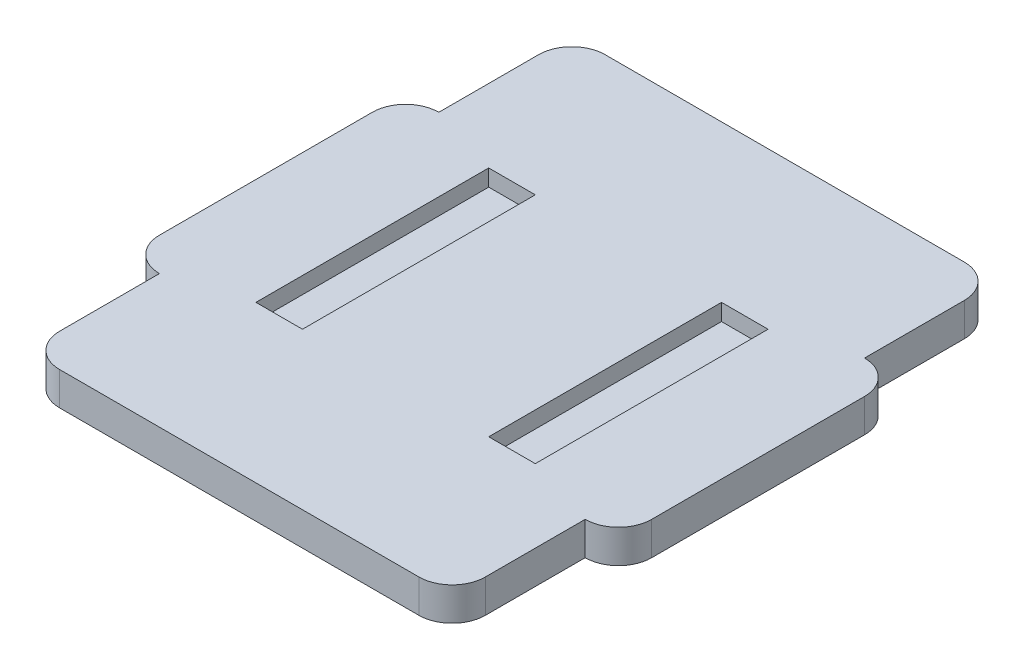
ISO-10303-21;
HEADER;
FILE_DESCRIPTION(('STEP AP214'),'2;1');
FILE_NAME('part.step','',(''),(''),'','','');
FILE_SCHEMA(('AUTOMOTIVE_DESIGN { 1 0 10303 214 1 1 1 1 }'));
ENDSEC;
DATA;
#1=APPLICATION_CONTEXT('core data for automotive mechanical design processes');
#2=APPLICATION_PROTOCOL_DEFINITION('international standard','automotive_design',2000,#1);
#3=PRODUCT_CONTEXT('',#1,'mechanical');
#4=PRODUCT('Part','Part','',(#3));
#5=PRODUCT_RELATED_PRODUCT_CATEGORY('part','',(#4));
#6=PRODUCT_DEFINITION_FORMATION('','',#4);
#7=PRODUCT_DEFINITION_CONTEXT('part definition',#1,'design');
#8=PRODUCT_DEFINITION('design','',#6,#7);
#9=PRODUCT_DEFINITION_SHAPE('','',#8);
#10=(LENGTH_UNIT() NAMED_UNIT(*) SI_UNIT(.MILLI.,.METRE.));
#11=(NAMED_UNIT(*) PLANE_ANGLE_UNIT() SI_UNIT($,.RADIAN.));
#12=(NAMED_UNIT(*) SI_UNIT($,.STERADIAN.) SOLID_ANGLE_UNIT());
#13=UNCERTAINTY_MEASURE_WITH_UNIT(LENGTH_MEASURE(1.E-05),#10,'distance_accuracy_value','');
#14=(GEOMETRIC_REPRESENTATION_CONTEXT(3) GLOBAL_UNCERTAINTY_ASSIGNED_CONTEXT((#13)) GLOBAL_UNIT_ASSIGNED_CONTEXT((#10,
#11,#12)) REPRESENTATION_CONTEXT('',''));
#15=CARTESIAN_POINT('',(0.,0.,0.));
#16=DIRECTION('',(0.,0.,1.));
#17=DIRECTION('',(1.,0.,0.));
#18=AXIS2_PLACEMENT_3D('',#15,#16,#17);
#19=CARTESIAN_POINT('',(46.,5.,-37.));
#20=DIRECTION('',(0.,-1.,0.));
#21=DIRECTION('',(0.,0.,-1.));
#22=AXIS2_PLACEMENT_3D('',#19,#20,#21);
#23=CYLINDRICAL_SURFACE('',#22,5.);
#24=CARTESIAN_POINT('',(46.,0.,-37.));
#25=DIRECTION('',(0.,1.,0.));
#26=DIRECTION('',(0.,0.,1.));
#27=AXIS2_PLACEMENT_3D('',#24,#25,#26);
#28=CIRCLE('',#27,5.);
#29=CARTESIAN_POINT('',(51.,0.,-37.));
#30=VERTEX_POINT('',#29);
#31=CARTESIAN_POINT('',(46.,0.,-42.));
#32=VERTEX_POINT('',#31);
#33=EDGE_CURVE('E266',#30,#32,#28,.T.);
#34=ORIENTED_EDGE('',*,*,#33,.T.);
#35=DIRECTION('',(0.,-1.,0.));
#36=VECTOR('',#35,1.);
#37=CARTESIAN_POINT('',(46.,5.,-42.));
#38=LINE('',#37,#36);
#39=CARTESIAN_POINT('',(46.,5.,-42.));
#40=VERTEX_POINT('',#39);
#41=EDGE_CURVE('E11',#40,#32,#38,.T.);
#42=ORIENTED_EDGE('',*,*,#41,.F.);
#43=CARTESIAN_POINT('',(46.,5.,-37.));
#44=DIRECTION('',(0.,1.,0.));
#45=DIRECTION('',(0.,0.,1.));
#46=AXIS2_PLACEMENT_3D('',#43,#44,#45);
#47=CIRCLE('',#46,5.);
#48=CARTESIAN_POINT('',(51.,5.,-37.));
#49=VERTEX_POINT('',#48);
#50=EDGE_CURVE('E284',#49,#40,#47,.T.);
#51=ORIENTED_EDGE('',*,*,#50,.F.);
#52=DIRECTION('',(0.,-1.,0.));
#53=VECTOR('',#52,1.);
#54=CARTESIAN_POINT('',(51.,5.,-37.));
#55=LINE('',#54,#53);
#56=EDGE_CURVE('E236',#49,#30,#55,.T.);
#57=ORIENTED_EDGE('',*,*,#56,.T.);
#58=EDGE_LOOP('',(#34,#42,#51,#57));
#59=FACE_BOUND('',#58,.T.);
#60=ADVANCED_FACE('F43',(#59),#23,.T.);
#61=CARTESIAN_POINT('',(46.,5.,0.));
#62=DIRECTION('',(-1.,0.,0.));
#63=DIRECTION('',(0.,0.,1.));
#64=AXIS2_PLACEMENT_3D('',#61,#62,#63);
#65=PLANE('',#64);
#66=DIRECTION('',(0.,0.,-1.));
#67=VECTOR('',#66,1.);
#68=CARTESIAN_POINT('',(46.,0.,0.));
#69=LINE('',#68,#67);
#70=CARTESIAN_POINT('',(46.,0.,-57.));
#71=VERTEX_POINT('',#70);
#72=EDGE_CURVE('E326',#32,#71,#69,.T.);
#73=ORIENTED_EDGE('',*,*,#72,.T.);
#74=DIRECTION('',(0.,-1.,0.));
#75=VECTOR('',#74,1.);
#76=CARTESIAN_POINT('',(46.,5.,-57.));
#77=LINE('',#76,#75);
#78=CARTESIAN_POINT('',(46.,5.,-57.));
#79=VERTEX_POINT('',#78);
#80=EDGE_CURVE('E52',#79,#71,#77,.T.);
#81=ORIENTED_EDGE('',*,*,#80,.F.);
#82=DIRECTION('',(0.,0.,-1.));
#83=VECTOR('',#82,1.);
#84=CARTESIAN_POINT('',(46.,5.,0.));
#85=LINE('',#84,#83);
#86=EDGE_CURVE('E287',#40,#79,#85,.T.);
#87=ORIENTED_EDGE('',*,*,#86,.F.);
#88=ORIENTED_EDGE('',*,*,#41,.T.);
#89=EDGE_LOOP('',(#73,#81,#87,#88));
#90=FACE_BOUND('',#89,.T.);
#91=ADVANCED_FACE('F420',(#90),#65,.F.);
#92=CARTESIAN_POINT('',(41.,5.,-57.));
#93=DIRECTION('',(0.,-1.,0.));
#94=DIRECTION('',(0.,0.,-1.));
#95=AXIS2_PLACEMENT_3D('',#92,#93,#94);
#96=CYLINDRICAL_SURFACE('',#95,5.);
#97=CARTESIAN_POINT('',(41.,0.,-57.));
#98=DIRECTION('',(0.,1.,0.));
#99=DIRECTION('',(0.,0.,1.));
#100=AXIS2_PLACEMENT_3D('',#97,#98,#99);
#101=CIRCLE('',#100,5.);
#102=CARTESIAN_POINT('',(41.,0.,-62.));
#103=VERTEX_POINT('',#102);
#104=EDGE_CURVE('E328',#71,#103,#101,.T.);
#105=ORIENTED_EDGE('',*,*,#104,.T.);
#106=DIRECTION('',(0.,-1.,0.));
#107=VECTOR('',#106,1.);
#108=CARTESIAN_POINT('',(41.,5.,-62.));
#109=LINE('',#108,#107);
#110=CARTESIAN_POINT('',(41.,5.,-62.));
#111=VERTEX_POINT('',#110);
#112=EDGE_CURVE('E394',#111,#103,#109,.T.);
#113=ORIENTED_EDGE('',*,*,#112,.F.);
#114=CARTESIAN_POINT('',(41.,5.,-57.));
#115=DIRECTION('',(0.,1.,0.));
#116=DIRECTION('',(0.,0.,1.));
#117=AXIS2_PLACEMENT_3D('',#114,#115,#116);
#118=CIRCLE('',#117,5.);
#119=EDGE_CURVE('E289',#79,#111,#118,.T.);
#120=ORIENTED_EDGE('',*,*,#119,.F.);
#121=ORIENTED_EDGE('',*,*,#80,.T.);
#122=EDGE_LOOP('',(#105,#113,#120,#121));
#123=FACE_BOUND('',#122,.T.);
#124=ADVANCED_FACE('F401',(#123),#96,.T.);
#125=CARTESIAN_POINT('',(0.,5.,-62.));
#126=DIRECTION('',(0.,0.,-1.));
#127=DIRECTION('',(-1.,0.,0.));
#128=AXIS2_PLACEMENT_3D('',#125,#126,#127);
#129=PLANE('',#128);
#130=DIRECTION('',(1.,0.,0.));
#131=VECTOR('',#130,1.);
#132=CARTESIAN_POINT('',(0.,0.,-62.));
#133=LINE('',#132,#131);
#134=CARTESIAN_POINT('',(-13.,0.,-62.));
#135=VERTEX_POINT('',#134);
#136=EDGE_CURVE('E331',#135,#103,#133,.T.);
#137=ORIENTED_EDGE('',*,*,#136,.F.);
#138=DIRECTION('',(0.,-1.,0.));
#139=VECTOR('',#138,1.);
#140=CARTESIAN_POINT('',(-13.,5.,-62.));
#141=LINE('',#140,#139);
#142=CARTESIAN_POINT('',(-13.,5.,-62.));
#143=VERTEX_POINT('',#142);
#144=EDGE_CURVE('E392',#143,#135,#141,.T.);
#145=ORIENTED_EDGE('',*,*,#144,.F.);
#146=DIRECTION('',(1.,0.,0.));
#147=VECTOR('',#146,1.);
#148=CARTESIAN_POINT('',(0.,5.,-62.));
#149=LINE('',#148,#147);
#150=EDGE_CURVE('E291',#143,#111,#149,.T.);
#151=ORIENTED_EDGE('',*,*,#150,.T.);
#152=ORIENTED_EDGE('',*,*,#112,.T.);
#153=EDGE_LOOP('',(#137,#145,#151,#152));
#154=FACE_BOUND('',#153,.T.);
#155=ADVANCED_FACE('F410',(#154),#129,.T.);
#156=CARTESIAN_POINT('',(-13.,5.,-57.));
#157=DIRECTION('',(0.,-1.,0.));
#158=DIRECTION('',(0.,0.,-1.));
#159=AXIS2_PLACEMENT_3D('',#156,#157,#158);
#160=CYLINDRICAL_SURFACE('',#159,5.);
#161=CARTESIAN_POINT('',(-13.,0.,-57.));
#162=DIRECTION('',(0.,1.,0.));
#163=DIRECTION('',(0.,0.,1.));
#164=AXIS2_PLACEMENT_3D('',#161,#162,#163);
#165=CIRCLE('',#164,5.);
#166=CARTESIAN_POINT('',(-18.,0.,-57.));
#167=VERTEX_POINT('',#166);
#168=EDGE_CURVE('E334',#135,#167,#165,.T.);
#169=ORIENTED_EDGE('',*,*,#168,.T.);
#170=DIRECTION('',(0.,-1.,0.));
#171=VECTOR('',#170,1.);
#172=CARTESIAN_POINT('',(-18.,5.,-57.));
#173=LINE('',#172,#171);
#174=CARTESIAN_POINT('',(-18.,5.,-57.));
#175=VERTEX_POINT('',#174);
#176=EDGE_CURVE('E390',#175,#167,#173,.T.);
#177=ORIENTED_EDGE('',*,*,#176,.F.);
#178=CARTESIAN_POINT('',(-13.,5.,-57.));
#179=DIRECTION('',(0.,1.,0.));
#180=DIRECTION('',(0.,0.,1.));
#181=AXIS2_PLACEMENT_3D('',#178,#179,#180);
#182=CIRCLE('',#181,5.);
#183=EDGE_CURVE('E294',#143,#175,#182,.T.);
#184=ORIENTED_EDGE('',*,*,#183,.F.);
#185=ORIENTED_EDGE('',*,*,#144,.T.);
#186=EDGE_LOOP('',(#169,#177,#184,#185));
#187=FACE_BOUND('',#186,.T.);
#188=ADVANCED_FACE('F468',(#187),#160,.T.);
#189=CARTESIAN_POINT('',(-18.,5.,0.));
#190=DIRECTION('',(-1.,0.,0.));
#191=DIRECTION('',(0.,0.,1.));
#192=AXIS2_PLACEMENT_3D('',#189,#190,#191);
#193=PLANE('',#192);
#194=DIRECTION('',(0.,0.,-1.));
#195=VECTOR('',#194,1.);
#196=CARTESIAN_POINT('',(-18.,0.,0.));
#197=LINE('',#196,#195);
#198=CARTESIAN_POINT('',(-18.,0.,-42.));
#199=VERTEX_POINT('',#198);
#200=EDGE_CURVE('E337',#199,#167,#197,.T.);
#201=ORIENTED_EDGE('',*,*,#200,.F.);
#202=DIRECTION('',(0.,-1.,0.));
#203=VECTOR('',#202,1.);
#204=CARTESIAN_POINT('',(-18.,5.,-42.));
#205=LINE('',#204,#203);
#206=CARTESIAN_POINT('',(-18.,5.,-42.));
#207=VERTEX_POINT('',#206);
#208=EDGE_CURVE('E388',#207,#199,#205,.T.);
#209=ORIENTED_EDGE('',*,*,#208,.F.);
#210=DIRECTION('',(0.,0.,-1.));
#211=VECTOR('',#210,1.);
#212=CARTESIAN_POINT('',(-18.,5.,0.));
#213=LINE('',#212,#211);
#214=EDGE_CURVE('E296',#207,#175,#213,.T.);
#215=ORIENTED_EDGE('',*,*,#214,.T.);
#216=ORIENTED_EDGE('',*,*,#176,.T.);
#217=EDGE_LOOP('',(#201,#209,#215,#216));
#218=FACE_BOUND('',#217,.T.);
#219=ADVANCED_FACE('F466',(#218),#193,.T.);
#220=CARTESIAN_POINT('',(-18.,5.,-37.));
#221=DIRECTION('',(0.,-1.,0.));
#222=DIRECTION('',(0.,0.,-1.));
#223=AXIS2_PLACEMENT_3D('',#220,#221,#222);
#224=CYLINDRICAL_SURFACE('',#223,5.);
#225=CARTESIAN_POINT('',(-18.,0.,-37.));
#226=DIRECTION('',(0.,1.,0.));
#227=DIRECTION('',(0.,0.,1.));
#228=AXIS2_PLACEMENT_3D('',#225,#226,#227);
#229=CIRCLE('',#228,5.);
#230=CARTESIAN_POINT('',(-23.,0.,-37.));
#231=VERTEX_POINT('',#230);
#232=EDGE_CURVE('E340',#231,#199,#229,.F.);
#233=ORIENTED_EDGE('',*,*,#232,.F.);
#234=DIRECTION('',(0.,-1.,0.));
#235=VECTOR('',#234,1.);
#236=CARTESIAN_POINT('',(-23.,5.,-37.));
#237=LINE('',#236,#235);
#238=CARTESIAN_POINT('',(-23.,5.,-37.));
#239=VERTEX_POINT('',#238);
#240=EDGE_CURVE('E386',#239,#231,#237,.T.);
#241=ORIENTED_EDGE('',*,*,#240,.F.);
#242=CARTESIAN_POINT('',(-18.,5.,-37.));
#243=DIRECTION('',(0.,1.,0.));
#244=DIRECTION('',(0.,0.,1.));
#245=AXIS2_PLACEMENT_3D('',#242,#243,#244);
#246=CIRCLE('',#245,5.);
#247=EDGE_CURVE('E299',#239,#207,#246,.F.);
#248=ORIENTED_EDGE('',*,*,#247,.T.);
#249=ORIENTED_EDGE('',*,*,#208,.T.);
#250=EDGE_LOOP('',(#233,#241,#248,#249));
#251=FACE_BOUND('',#250,.T.);
#252=ADVANCED_FACE('F463',(#251),#224,.T.);
#253=CARTESIAN_POINT('',(-23.,5.,0.));
#254=DIRECTION('',(-1.,0.,0.));
#255=DIRECTION('',(0.,0.,1.));
#256=AXIS2_PLACEMENT_3D('',#253,#254,#255);
#257=PLANE('',#256);
#258=DIRECTION('',(0.,0.,-1.));
#259=VECTOR('',#258,1.);
#260=CARTESIAN_POINT('',(-23.,0.,0.));
#261=LINE('',#260,#259);
#262=CARTESIAN_POINT('',(-23.,0.,-5.));
#263=VERTEX_POINT('',#262);
#264=EDGE_CURVE('E343',#263,#231,#261,.T.);
#265=ORIENTED_EDGE('',*,*,#264,.F.);
#266=DIRECTION('',(0.,-1.,0.));
#267=VECTOR('',#266,1.);
#268=CARTESIAN_POINT('',(-23.,5.,-5.));
#269=LINE('',#268,#267);
#270=CARTESIAN_POINT('',(-23.,5.,-5.));
#271=VERTEX_POINT('',#270);
#272=EDGE_CURVE('E384',#271,#263,#269,.T.);
#273=ORIENTED_EDGE('',*,*,#272,.F.);
#274=DIRECTION('',(0.,0.,-1.));
#275=VECTOR('',#274,1.);
#276=CARTESIAN_POINT('',(-23.,5.,0.));
#277=LINE('',#276,#275);
#278=EDGE_CURVE('E302',#271,#239,#277,.T.);
#279=ORIENTED_EDGE('',*,*,#278,.T.);
#280=ORIENTED_EDGE('',*,*,#240,.T.);
#281=EDGE_LOOP('',(#265,#273,#279,#280));
#282=FACE_BOUND('',#281,.T.);
#283=ADVANCED_FACE('F459',(#282),#257,.T.);
#284=CARTESIAN_POINT('',(-18.,5.,-5.));
#285=DIRECTION('',(0.,-1.,0.));
#286=DIRECTION('',(0.,0.,-1.));
#287=AXIS2_PLACEMENT_3D('',#284,#285,#286);
#288=CYLINDRICAL_SURFACE('',#287,5.);
#289=CARTESIAN_POINT('',(-18.,0.,-5.));
#290=DIRECTION('',(0.,1.,0.));
#291=DIRECTION('',(0.,0.,1.));
#292=AXIS2_PLACEMENT_3D('',#289,#290,#291);
#293=CIRCLE('',#292,5.);
#294=CARTESIAN_POINT('',(-18.,0.,0.));
#295=VERTEX_POINT('',#294);
#296=EDGE_CURVE('E346',#295,#263,#293,.F.);
#297=ORIENTED_EDGE('',*,*,#296,.F.);
#298=DIRECTION('',(0.,-1.,0.));
#299=VECTOR('',#298,1.);
#300=CARTESIAN_POINT('',(-18.,5.,0.));
#301=LINE('',#300,#299);
#302=CARTESIAN_POINT('',(-18.,5.,0.));
#303=VERTEX_POINT('',#302);
#304=EDGE_CURVE('E382',#303,#295,#301,.T.);
#305=ORIENTED_EDGE('',*,*,#304,.F.);
#306=CARTESIAN_POINT('',(-18.,5.,-5.));
#307=DIRECTION('',(0.,1.,0.));
#308=DIRECTION('',(0.,0.,1.));
#309=AXIS2_PLACEMENT_3D('',#306,#307,#308);
#310=CIRCLE('',#309,5.);
#311=EDGE_CURVE('E305',#303,#271,#310,.F.);
#312=ORIENTED_EDGE('',*,*,#311,.T.);
#313=ORIENTED_EDGE('',*,*,#272,.T.);
#314=EDGE_LOOP('',(#297,#305,#312,#313));
#315=FACE_BOUND('',#314,.T.);
#316=ADVANCED_FACE('F454',(#315),#288,.T.);
#317=CARTESIAN_POINT('',(-18.,5.,0.));
#318=DIRECTION('',(1.,0.,0.));
#319=DIRECTION('',(0.,0.,-1.));
#320=AXIS2_PLACEMENT_3D('',#317,#318,#319);
#321=PLANE('',#320);
#322=DIRECTION('',(0.,0.,1.));
#323=VECTOR('',#322,1.);
#324=CARTESIAN_POINT('',(-18.,0.,0.));
#325=LINE('',#324,#323);
#326=CARTESIAN_POINT('',(-18.,0.,15.));
#327=VERTEX_POINT('',#326);
#328=EDGE_CURVE('E349',#295,#327,#325,.T.);
#329=ORIENTED_EDGE('',*,*,#328,.T.);
#330=DIRECTION('',(0.,-1.,0.));
#331=VECTOR('',#330,1.);
#332=CARTESIAN_POINT('',(-18.,5.,15.));
#333=LINE('',#332,#331);
#334=CARTESIAN_POINT('',(-18.,5.,15.));
#335=VERTEX_POINT('',#334);
#336=EDGE_CURVE('E380',#335,#327,#333,.T.);
#337=ORIENTED_EDGE('',*,*,#336,.F.);
#338=DIRECTION('',(0.,0.,1.));
#339=VECTOR('',#338,1.);
#340=CARTESIAN_POINT('',(-18.,5.,0.));
#341=LINE('',#340,#339);
#342=EDGE_CURVE('E308',#303,#335,#341,.T.);
#343=ORIENTED_EDGE('',*,*,#342,.F.);
#344=ORIENTED_EDGE('',*,*,#304,.T.);
#345=EDGE_LOOP('',(#329,#337,#343,#344));
#346=FACE_BOUND('',#345,.T.);
#347=ADVANCED_FACE('F451',(#346),#321,.F.);
#348=CARTESIAN_POINT('',(-13.,5.,15.));
#349=DIRECTION('',(0.,-1.,0.));
#350=DIRECTION('',(0.,0.,-1.));
#351=AXIS2_PLACEMENT_3D('',#348,#349,#350);
#352=CYLINDRICAL_SURFACE('',#351,5.);
#353=CARTESIAN_POINT('',(-13.,0.,15.));
#354=DIRECTION('',(0.,1.,0.));
#355=DIRECTION('',(0.,0.,1.));
#356=AXIS2_PLACEMENT_3D('',#353,#354,#355);
#357=CIRCLE('',#356,5.);
#358=CARTESIAN_POINT('',(-13.,0.,20.));
#359=VERTEX_POINT('',#358);
#360=EDGE_CURVE('E352',#359,#327,#357,.F.);
#361=ORIENTED_EDGE('',*,*,#360,.F.);
#362=DIRECTION('',(0.,-1.,0.));
#363=VECTOR('',#362,1.);
#364=CARTESIAN_POINT('',(-13.,5.,20.));
#365=LINE('',#364,#363);
#366=CARTESIAN_POINT('',(-13.,5.,20.));
#367=VERTEX_POINT('',#366);
#368=EDGE_CURVE('E378',#367,#359,#365,.T.);
#369=ORIENTED_EDGE('',*,*,#368,.F.);
#370=CARTESIAN_POINT('',(-13.,5.,15.));
#371=DIRECTION('',(0.,1.,0.));
#372=DIRECTION('',(0.,0.,1.));
#373=AXIS2_PLACEMENT_3D('',#370,#371,#372);
#374=CIRCLE('',#373,5.);
#375=EDGE_CURVE('E310',#367,#335,#374,.F.);
#376=ORIENTED_EDGE('',*,*,#375,.T.);
#377=ORIENTED_EDGE('',*,*,#336,.T.);
#378=EDGE_LOOP('',(#361,#369,#376,#377));
#379=FACE_BOUND('',#378,.T.);
#380=ADVANCED_FACE('F445',(#379),#352,.T.);
#381=CARTESIAN_POINT('',(0.,5.,20.));
#382=DIRECTION('',(0.,0.,-1.));
#383=DIRECTION('',(-1.,0.,0.));
#384=AXIS2_PLACEMENT_3D('',#381,#382,#383);
#385=PLANE('',#384);
#386=DIRECTION('',(1.,0.,0.));
#387=VECTOR('',#386,1.);
#388=CARTESIAN_POINT('',(0.,0.,20.));
#389=LINE('',#388,#387);
#390=CARTESIAN_POINT('',(41.,0.,20.));
#391=VERTEX_POINT('',#390);
#392=EDGE_CURVE('E355',#359,#391,#389,.T.);
#393=ORIENTED_EDGE('',*,*,#392,.T.);
#394=DIRECTION('',(0.,-1.,0.));
#395=VECTOR('',#394,1.);
#396=CARTESIAN_POINT('',(41.,5.,20.));
#397=LINE('',#396,#395);
#398=CARTESIAN_POINT('',(41.,5.,20.));
#399=VERTEX_POINT('',#398);
#400=EDGE_CURVE('E375',#399,#391,#397,.T.);
#401=ORIENTED_EDGE('',*,*,#400,.F.);
#402=DIRECTION('',(1.,0.,0.));
#403=VECTOR('',#402,1.);
#404=CARTESIAN_POINT('',(0.,5.,20.));
#405=LINE('',#404,#403);
#406=EDGE_CURVE('E313',#367,#399,#405,.T.);
#407=ORIENTED_EDGE('',*,*,#406,.F.);
#408=ORIENTED_EDGE('',*,*,#368,.T.);
#409=EDGE_LOOP('',(#393,#401,#407,#408));
#410=FACE_BOUND('',#409,.T.);
#411=ADVANCED_FACE('F533',(#410),#385,.F.);
#412=CARTESIAN_POINT('',(41.,5.,15.));
#413=DIRECTION('',(0.,-1.,0.));
#414=DIRECTION('',(0.,0.,-1.));
#415=AXIS2_PLACEMENT_3D('',#412,#413,#414);
#416=CYLINDRICAL_SURFACE('',#415,5.);
#417=CARTESIAN_POINT('',(41.,0.,15.));
#418=DIRECTION('',(0.,1.,0.));
#419=DIRECTION('',(0.,0.,1.));
#420=AXIS2_PLACEMENT_3D('',#417,#418,#419);
#421=CIRCLE('',#420,5.);
#422=CARTESIAN_POINT('',(46.,0.,15.));
#423=VERTEX_POINT('',#422);
#424=EDGE_CURVE('E357',#391,#423,#421,.T.);
#425=ORIENTED_EDGE('',*,*,#424,.T.);
#426=DIRECTION('',(0.,-1.,0.));
#427=VECTOR('',#426,1.);
#428=CARTESIAN_POINT('',(46.,5.,15.));
#429=LINE('',#428,#427);
#430=CARTESIAN_POINT('',(46.,5.,15.));
#431=VERTEX_POINT('',#430);
#432=EDGE_CURVE('E373',#431,#423,#429,.T.);
#433=ORIENTED_EDGE('',*,*,#432,.F.);
#434=CARTESIAN_POINT('',(41.,5.,15.));
#435=DIRECTION('',(0.,1.,0.));
#436=DIRECTION('',(0.,0.,1.));
#437=AXIS2_PLACEMENT_3D('',#434,#435,#436);
#438=CIRCLE('',#437,5.);
#439=EDGE_CURVE('E315',#399,#431,#438,.T.);
#440=ORIENTED_EDGE('',*,*,#439,.F.);
#441=ORIENTED_EDGE('',*,*,#400,.T.);
#442=EDGE_LOOP('',(#425,#433,#440,#441));
#443=FACE_BOUND('',#442,.T.);
#444=ADVANCED_FACE('F438',(#443),#416,.T.);
#445=CARTESIAN_POINT('',(46.,5.,0.));
#446=DIRECTION('',(1.,0.,0.));
#447=DIRECTION('',(0.,0.,-1.));
#448=AXIS2_PLACEMENT_3D('',#445,#446,#447);
#449=PLANE('',#448);
#450=DIRECTION('',(0.,0.,1.));
#451=VECTOR('',#450,1.);
#452=CARTESIAN_POINT('',(46.,0.,0.));
#453=LINE('',#452,#451);
#454=CARTESIAN_POINT('',(46.,0.,0.));
#455=VERTEX_POINT('',#454);
#456=EDGE_CURVE('E360',#455,#423,#453,.T.);
#457=ORIENTED_EDGE('',*,*,#456,.F.);
#458=DIRECTION('',(0.,-1.,0.));
#459=VECTOR('',#458,1.);
#460=CARTESIAN_POINT('',(46.,5.,0.));
#461=LINE('',#460,#459);
#462=CARTESIAN_POINT('',(46.,5.,0.));
#463=VERTEX_POINT('',#462);
#464=EDGE_CURVE('E371',#463,#455,#461,.T.);
#465=ORIENTED_EDGE('',*,*,#464,.F.);
#466=DIRECTION('',(0.,0.,1.));
#467=VECTOR('',#466,1.);
#468=CARTESIAN_POINT('',(46.,5.,0.));
#469=LINE('',#468,#467);
#470=EDGE_CURVE('E317',#463,#431,#469,.T.);
#471=ORIENTED_EDGE('',*,*,#470,.T.);
#472=ORIENTED_EDGE('',*,*,#432,.T.);
#473=EDGE_LOOP('',(#457,#465,#471,#472));
#474=FACE_BOUND('',#473,.T.);
#475=ADVANCED_FACE('F433',(#474),#449,.T.);
#476=CARTESIAN_POINT('',(46.,5.,-5.));
#477=DIRECTION('',(0.,-1.,0.));
#478=DIRECTION('',(0.,0.,-1.));
#479=AXIS2_PLACEMENT_3D('',#476,#477,#478);
#480=CYLINDRICAL_SURFACE('',#479,5.);
#481=CARTESIAN_POINT('',(46.,0.,-5.));
#482=DIRECTION('',(0.,1.,0.));
#483=DIRECTION('',(0.,0.,1.));
#484=AXIS2_PLACEMENT_3D('',#481,#482,#483);
#485=CIRCLE('',#484,5.);
#486=CARTESIAN_POINT('',(51.,0.,-5.00000000000004));
#487=VERTEX_POINT('',#486);
#488=EDGE_CURVE('E363',#455,#487,#485,.T.);
#489=ORIENTED_EDGE('',*,*,#488,.T.);
#490=DIRECTION('',(0.,-1.,0.));
#491=VECTOR('',#490,1.);
#492=CARTESIAN_POINT('',(51.,5.,-5.00000000000004));
#493=LINE('',#492,#491);
#494=CARTESIAN_POINT('',(51.,5.,-5.00000000000004));
#495=VERTEX_POINT('',#494);
#496=EDGE_CURVE('E369',#495,#487,#493,.T.);
#497=ORIENTED_EDGE('',*,*,#496,.F.);
#498=CARTESIAN_POINT('',(46.,5.,-5.));
#499=DIRECTION('',(0.,1.,0.));
#500=DIRECTION('',(0.,0.,1.));
#501=AXIS2_PLACEMENT_3D('',#498,#499,#500);
#502=CIRCLE('',#501,5.);
#503=EDGE_CURVE('E320',#463,#495,#502,.T.);
#504=ORIENTED_EDGE('',*,*,#503,.F.);
#505=ORIENTED_EDGE('',*,*,#464,.T.);
#506=EDGE_LOOP('',(#489,#497,#504,#505));
#507=FACE_BOUND('',#506,.T.);
#508=ADVANCED_FACE('F429',(#507),#480,.T.);
#509=CARTESIAN_POINT('',(0.,5.,-38.5));
#510=DIRECTION('',(0.,0.,-1.));
#511=DIRECTION('',(-1.,0.,0.));
#512=AXIS2_PLACEMENT_3D('',#509,#510,#511);
#513=PLANE('',#512);
#514=DIRECTION('',(0.,-1.,0.));
#515=VECTOR('',#514,1.);
#516=CARTESIAN_POINT('',(28.,5.,-38.5));
#517=LINE('',#516,#515);
#518=CARTESIAN_POINT('',(28.,5.,-38.5));
#519=VERTEX_POINT('',#518);
#520=CARTESIAN_POINT('',(28.,2.5,-38.5));
#521=VERTEX_POINT('',#520);
#522=EDGE_CURVE('E228',#519,#521,#517,.T.);
#523=ORIENTED_EDGE('',*,*,#522,.T.);
#524=DIRECTION('',(1.,0.,0.));
#525=VECTOR('',#524,1.);
#526=CARTESIAN_POINT('',(0.,2.5,-38.5));
#527=LINE('',#526,#525);
#528=CARTESIAN_POINT('',(35.,2.5,-38.5));
#529=VERTEX_POINT('',#528);
#530=EDGE_CURVE('E60',#521,#529,#527,.T.);
#531=ORIENTED_EDGE('',*,*,#530,.T.);
#532=DIRECTION('',(0.,-1.,0.));
#533=VECTOR('',#532,1.);
#534=CARTESIAN_POINT('',(35.,5.,-38.5));
#535=LINE('',#534,#533);
#536=CARTESIAN_POINT('',(35.,5.,-38.5));
#537=VERTEX_POINT('',#536);
#538=EDGE_CURVE('E230',#537,#529,#535,.T.);
#539=ORIENTED_EDGE('',*,*,#538,.F.);
#540=DIRECTION('',(1.,0.,0.));
#541=VECTOR('',#540,1.);
#542=CARTESIAN_POINT('',(0.,5.,-38.5));
#543=LINE('',#542,#541);
#544=EDGE_CURVE('E276',#519,#537,#543,.T.);
#545=ORIENTED_EDGE('',*,*,#544,.F.);
#546=EDGE_LOOP('',(#523,#531,#539,#545));
#547=FACE_BOUND('',#546,.T.);
#548=ADVANCED_FACE('F494',(#547),#513,.F.);
#549=CARTESIAN_POINT('',(35.,5.,0.));
#550=DIRECTION('',(1.,0.,0.));
#551=DIRECTION('',(0.,0.,-1.));
#552=AXIS2_PLACEMENT_3D('',#549,#550,#551);
#553=PLANE('',#552);
#554=ORIENTED_EDGE('',*,*,#538,.T.);
#555=DIRECTION('',(0.,0.,1.));
#556=VECTOR('',#555,1.);
#557=CARTESIAN_POINT('',(35.,2.5,0.));
#558=LINE('',#557,#556);
#559=CARTESIAN_POINT('',(35.,2.5,-3.5));
#560=VERTEX_POINT('',#559);
#561=EDGE_CURVE('E223',#529,#560,#558,.T.);
#562=ORIENTED_EDGE('',*,*,#561,.T.);
#563=DIRECTION('',(0.,-1.,0.));
#564=VECTOR('',#563,1.);
#565=CARTESIAN_POINT('',(35.,5.,-3.5));
#566=LINE('',#565,#564);
#567=CARTESIAN_POINT('',(35.,5.,-3.5));
#568=VERTEX_POINT('',#567);
#569=EDGE_CURVE('E222',#568,#560,#566,.T.);
#570=ORIENTED_EDGE('',*,*,#569,.F.);
#571=DIRECTION('',(0.,0.,1.));
#572=VECTOR('',#571,1.);
#573=CARTESIAN_POINT('',(35.,5.,0.));
#574=LINE('',#573,#572);
#575=EDGE_CURVE('E279',#537,#568,#574,.T.);
#576=ORIENTED_EDGE('',*,*,#575,.F.);
#577=EDGE_LOOP('',(#554,#562,#570,#576));
#578=FACE_BOUND('',#577,.T.);
#579=ADVANCED_FACE('F491',(#578),#553,.F.);
#580=CARTESIAN_POINT('',(0.,5.,-3.49999999999998));
#581=DIRECTION('',(0.,0.,-1.));
#582=DIRECTION('',(-1.,0.,0.));
#583=AXIS2_PLACEMENT_3D('',#580,#581,#582);
#584=PLANE('',#583);
#585=DIRECTION('',(1.,0.,0.));
#586=VECTOR('',#585,1.);
#587=CARTESIAN_POINT('',(0.,2.5,-3.49999999999998));
#588=LINE('',#587,#586);
#589=CARTESIAN_POINT('',(28.,2.5,-3.5));
#590=VERTEX_POINT('',#589);
#591=EDGE_CURVE('E208',#590,#560,#588,.T.);
#592=ORIENTED_EDGE('',*,*,#591,.F.);
#593=DIRECTION('',(0.,-1.,0.));
#594=VECTOR('',#593,1.);
#595=CARTESIAN_POINT('',(28.,5.,-3.5));
#596=LINE('',#595,#594);
#597=CARTESIAN_POINT('',(28.,5.,-3.5));
#598=VERTEX_POINT('',#597);
#599=EDGE_CURVE('E219',#598,#590,#596,.T.);
#600=ORIENTED_EDGE('',*,*,#599,.F.);
#601=DIRECTION('',(1.,0.,0.));
#602=VECTOR('',#601,1.);
#603=CARTESIAN_POINT('',(0.,5.,-3.49999999999998));
#604=LINE('',#603,#602);
#605=EDGE_CURVE('E281',#598,#568,#604,.T.);
#606=ORIENTED_EDGE('',*,*,#605,.T.);
#607=ORIENTED_EDGE('',*,*,#569,.T.);
#608=EDGE_LOOP('',(#592,#600,#606,#607));
#609=FACE_BOUND('',#608,.T.);
#610=ADVANCED_FACE('F217',(#609),#584,.T.);
#611=CARTESIAN_POINT('',(0.,5.,-3.5));
#612=DIRECTION('',(0.,0.,1.));
#613=DIRECTION('',(1.,0.,0.));
#614=AXIS2_PLACEMENT_3D('',#611,#612,#613);
#615=PLANE('',#614);
#616=DIRECTION('',(0.,-1.,0.));
#617=VECTOR('',#616,1.);
#618=CARTESIAN_POINT('',(0.,5.,-3.5));
#619=LINE('',#618,#617);
#620=CARTESIAN_POINT('',(0.,5.,-3.5));
#621=VERTEX_POINT('',#620);
#622=CARTESIAN_POINT('',(0.,2.5,-3.5));
#623=VERTEX_POINT('',#622);
#624=EDGE_CURVE('E237',#621,#623,#619,.T.);
#625=ORIENTED_EDGE('',*,*,#624,.T.);
#626=DIRECTION('',(-1.,0.,0.));
#627=VECTOR('',#626,1.);
#628=CARTESIAN_POINT('',(0.,2.5,-3.5));
#629=LINE('',#628,#627);
#630=CARTESIAN_POINT('',(-7.,2.5,-3.5));
#631=VERTEX_POINT('',#630);
#632=EDGE_CURVE('E68',#623,#631,#629,.T.);
#633=ORIENTED_EDGE('',*,*,#632,.T.);
#634=DIRECTION('',(0.,-1.,0.));
#635=VECTOR('',#634,1.);
#636=CARTESIAN_POINT('',(-7.,5.,-3.5));
#637=LINE('',#636,#635);
#638=CARTESIAN_POINT('',(-7.,5.,-3.5));
#639=VERTEX_POINT('',#638);
#640=EDGE_CURVE('E47',#639,#631,#637,.T.);
#641=ORIENTED_EDGE('',*,*,#640,.F.);
#642=DIRECTION('',(-1.,0.,0.));
#643=VECTOR('',#642,1.);
#644=CARTESIAN_POINT('',(0.,5.,-3.5));
#645=LINE('',#644,#643);
#646=EDGE_CURVE('E267',#621,#639,#645,.T.);
#647=ORIENTED_EDGE('',*,*,#646,.F.);
#648=EDGE_LOOP('',(#625,#633,#641,#647));
#649=FACE_BOUND('',#648,.T.);
#650=ADVANCED_FACE('F45',(#649),#615,.F.);
#651=CARTESIAN_POINT('',(-7.,5.,0.));
#652=DIRECTION('',(-1.,0.,0.));
#653=DIRECTION('',(0.,0.,1.));
#654=AXIS2_PLACEMENT_3D('',#651,#652,#653);
#655=PLANE('',#654);
#656=ORIENTED_EDGE('',*,*,#640,.T.);
#657=DIRECTION('',(0.,0.,1.));
#658=VECTOR('',#657,1.);
#659=CARTESIAN_POINT('',(-7.,2.5,0.));
#660=LINE('',#659,#658);
#661=CARTESIAN_POINT('',(-7.,2.5,-38.5));
#662=VERTEX_POINT('',#661);
#663=EDGE_CURVE('E251',#662,#631,#660,.T.);
#664=ORIENTED_EDGE('',*,*,#663,.F.);
#665=DIRECTION('',(0.,-1.,0.));
#666=VECTOR('',#665,1.);
#667=CARTESIAN_POINT('',(-7.,5.,-38.5));
#668=LINE('',#667,#666);
#669=CARTESIAN_POINT('',(-7.,5.,-38.5));
#670=VERTEX_POINT('',#669);
#671=EDGE_CURVE('E241',#670,#662,#668,.T.);
#672=ORIENTED_EDGE('',*,*,#671,.F.);
#673=DIRECTION('',(0.,0.,-1.));
#674=VECTOR('',#673,1.);
#675=CARTESIAN_POINT('',(-7.,5.,0.));
#676=LINE('',#675,#674);
#677=EDGE_CURVE('E252',#639,#670,#676,.T.);
#678=ORIENTED_EDGE('',*,*,#677,.F.);
#679=EDGE_LOOP('',(#656,#664,#672,#678));
#680=FACE_BOUND('',#679,.T.);
#681=ADVANCED_FACE('F250',(#680),#655,.F.);
#682=CARTESIAN_POINT('',(0.,5.,-38.5));
#683=DIRECTION('',(0.,0.,1.));
#684=DIRECTION('',(1.,0.,0.));
#685=AXIS2_PLACEMENT_3D('',#682,#683,#684);
#686=PLANE('',#685);
#687=DIRECTION('',(-1.,0.,0.));
#688=VECTOR('',#687,1.);
#689=CARTESIAN_POINT('',(0.,2.5,-38.5));
#690=LINE('',#689,#688);
#691=CARTESIAN_POINT('',(0.,2.5,-38.5));
#692=VERTEX_POINT('',#691);
#693=EDGE_CURVE('E258',#692,#662,#690,.T.);
#694=ORIENTED_EDGE('',*,*,#693,.F.);
#695=DIRECTION('',(0.,-1.,0.));
#696=VECTOR('',#695,1.);
#697=CARTESIAN_POINT('',(0.,5.,-38.5));
#698=LINE('',#697,#696);
#699=CARTESIAN_POINT('',(0.,5.,-38.5));
#700=VERTEX_POINT('',#699);
#701=EDGE_CURVE('E239',#700,#692,#698,.T.);
#702=ORIENTED_EDGE('',*,*,#701,.F.);
#703=DIRECTION('',(-1.,0.,0.));
#704=VECTOR('',#703,1.);
#705=CARTESIAN_POINT('',(0.,5.,-38.5));
#706=LINE('',#705,#704);
#707=EDGE_CURVE('E271',#700,#670,#706,.T.);
#708=ORIENTED_EDGE('',*,*,#707,.T.);
#709=ORIENTED_EDGE('',*,*,#671,.T.);
#710=EDGE_LOOP('',(#694,#702,#708,#709));
#711=FACE_BOUND('',#710,.T.);
#712=ADVANCED_FACE('F488',(#711),#686,.T.);
#713=CARTESIAN_POINT('',(28.,5.,0.));
#714=DIRECTION('',(-1.,0.,0.));
#715=DIRECTION('',(0.,0.,1.));
#716=AXIS2_PLACEMENT_3D('',#713,#714,#715);
#717=PLANE('',#716);
#718=ORIENTED_EDGE('',*,*,#599,.T.);
#719=DIRECTION('',(0.,0.,-1.));
#720=VECTOR('',#719,1.);
#721=CARTESIAN_POINT('',(28.,2.5,0.));
#722=LINE('',#721,#720);
#723=EDGE_CURVE('E205',#590,#521,#722,.T.);
#724=ORIENTED_EDGE('',*,*,#723,.T.);
#725=ORIENTED_EDGE('',*,*,#522,.F.);
#726=DIRECTION('',(0.,0.,-1.));
#727=VECTOR('',#726,1.);
#728=CARTESIAN_POINT('',(28.,5.,0.));
#729=LINE('',#728,#727);
#730=EDGE_CURVE('E226',#598,#519,#729,.T.);
#731=ORIENTED_EDGE('',*,*,#730,.F.);
#732=EDGE_LOOP('',(#718,#724,#725,#731));
#733=FACE_BOUND('',#732,.T.);
#734=ADVANCED_FACE('F225',(#733),#717,.F.);
#735=CARTESIAN_POINT('',(0.,5.,0.));
#736=DIRECTION('',(-1.,0.,0.));
#737=DIRECTION('',(0.,0.,1.));
#738=AXIS2_PLACEMENT_3D('',#735,#736,#737);
#739=PLANE('',#738);
#740=DIRECTION('',(0.,0.,-1.));
#741=VECTOR('',#740,1.);
#742=CARTESIAN_POINT('',(0.,2.5,0.));
#743=LINE('',#742,#741);
#744=EDGE_CURVE('E260',#623,#692,#743,.T.);
#745=ORIENTED_EDGE('',*,*,#744,.F.);
#746=ORIENTED_EDGE('',*,*,#624,.F.);
#747=DIRECTION('',(0.,0.,-1.));
#748=VECTOR('',#747,1.);
#749=CARTESIAN_POINT('',(0.,5.,0.));
#750=LINE('',#749,#748);
#751=EDGE_CURVE('E273',#621,#700,#750,.T.);
#752=ORIENTED_EDGE('',*,*,#751,.T.);
#753=ORIENTED_EDGE('',*,*,#701,.T.);
#754=EDGE_LOOP('',(#745,#746,#752,#753));
#755=FACE_BOUND('',#754,.T.);
#756=ADVANCED_FACE('F487',(#755),#739,.T.);
#757=CARTESIAN_POINT('',(51.,5.,0.));
#758=DIRECTION('',(1.,0.,0.));
#759=DIRECTION('',(0.,0.,-1.));
#760=AXIS2_PLACEMENT_3D('',#757,#758,#759);
#761=PLANE('',#760);
#762=DIRECTION('',(0.,0.,1.));
#763=VECTOR('',#762,1.);
#764=CARTESIAN_POINT('',(51.,0.,0.));
#765=LINE('',#764,#763);
#766=EDGE_CURVE('E269',#30,#487,#765,.T.);
#767=ORIENTED_EDGE('',*,*,#766,.F.);
#768=ORIENTED_EDGE('',*,*,#56,.F.);
#769=DIRECTION('',(0.,0.,1.));
#770=VECTOR('',#769,1.);
#771=CARTESIAN_POINT('',(51.,5.,0.));
#772=LINE('',#771,#770);
#773=EDGE_CURVE('E240',#49,#495,#772,.T.);
#774=ORIENTED_EDGE('',*,*,#773,.T.);
#775=ORIENTED_EDGE('',*,*,#496,.T.);
#776=EDGE_LOOP('',(#767,#768,#774,#775));
#777=FACE_BOUND('',#776,.T.);
#778=ADVANCED_FACE('F425',(#777),#761,.T.);
#779=CARTESIAN_POINT('',(0.,5.,0.));
#780=DIRECTION('',(0.,1.,0.));
#781=DIRECTION('',(0.,0.,1.));
#782=AXIS2_PLACEMENT_3D('',#779,#780,#781);
#783=PLANE('',#782);
#784=ORIENTED_EDGE('',*,*,#646,.T.);
#785=ORIENTED_EDGE('',*,*,#677,.T.);
#786=ORIENTED_EDGE('',*,*,#707,.F.);
#787=ORIENTED_EDGE('',*,*,#751,.F.);
#788=EDGE_LOOP('',(#784,#785,#786,#787));
#789=FACE_BOUND('',#788,.T.);
#790=ORIENTED_EDGE('',*,*,#544,.T.);
#791=ORIENTED_EDGE('',*,*,#575,.T.);
#792=ORIENTED_EDGE('',*,*,#605,.F.);
#793=ORIENTED_EDGE('',*,*,#730,.T.);
#794=EDGE_LOOP('',(#790,#791,#792,#793));
#795=FACE_BOUND('',#794,.T.);
#796=ORIENTED_EDGE('',*,*,#50,.T.);
#797=ORIENTED_EDGE('',*,*,#86,.T.);
#798=ORIENTED_EDGE('',*,*,#119,.T.);
#799=ORIENTED_EDGE('',*,*,#150,.F.);
#800=ORIENTED_EDGE('',*,*,#183,.T.);
#801=ORIENTED_EDGE('',*,*,#214,.F.);
#802=ORIENTED_EDGE('',*,*,#247,.F.);
#803=ORIENTED_EDGE('',*,*,#278,.F.);
#804=ORIENTED_EDGE('',*,*,#311,.F.);
#805=ORIENTED_EDGE('',*,*,#342,.T.);
#806=ORIENTED_EDGE('',*,*,#375,.F.);
#807=ORIENTED_EDGE('',*,*,#406,.T.);
#808=ORIENTED_EDGE('',*,*,#439,.T.);
#809=ORIENTED_EDGE('',*,*,#470,.F.);
#810=ORIENTED_EDGE('',*,*,#503,.T.);
#811=ORIENTED_EDGE('',*,*,#773,.F.);
#812=EDGE_LOOP('',(#796,#797,#798,#799,#800,#801,#802,#803,#804,#805,#806,#807,#808,#809,#810,#811));
#813=FACE_BOUND('',#812,.T.);
#814=ADVANCED_FACE('F414',(#789,#795,#813),#783,.T.);
#815=CARTESIAN_POINT('',(0.,0.,0.));
#816=DIRECTION('',(0.,1.,0.));
#817=DIRECTION('',(0.,0.,1.));
#818=AXIS2_PLACEMENT_3D('',#815,#816,#817);
#819=PLANE('',#818);
#820=ORIENTED_EDGE('',*,*,#33,.F.);
#821=ORIENTED_EDGE('',*,*,#766,.T.);
#822=ORIENTED_EDGE('',*,*,#488,.F.);
#823=ORIENTED_EDGE('',*,*,#456,.T.);
#824=ORIENTED_EDGE('',*,*,#424,.F.);
#825=ORIENTED_EDGE('',*,*,#392,.F.);
#826=ORIENTED_EDGE('',*,*,#360,.T.);
#827=ORIENTED_EDGE('',*,*,#328,.F.);
#828=ORIENTED_EDGE('',*,*,#296,.T.);
#829=ORIENTED_EDGE('',*,*,#264,.T.);
#830=ORIENTED_EDGE('',*,*,#232,.T.);
#831=ORIENTED_EDGE('',*,*,#200,.T.);
#832=ORIENTED_EDGE('',*,*,#168,.F.);
#833=ORIENTED_EDGE('',*,*,#136,.T.);
#834=ORIENTED_EDGE('',*,*,#104,.F.);
#835=ORIENTED_EDGE('',*,*,#72,.F.);
#836=EDGE_LOOP('',(#820,#821,#822,#823,#824,#825,#826,#827,#828,#829,#830,#831,#832,#833,#834,#835));
#837=FACE_BOUND('',#836,.T.);
#838=ADVANCED_FACE('F406',(#837),#819,.F.);
#839=CARTESIAN_POINT('',(0.,2.5,0.));
#840=DIRECTION('',(0.,1.,0.));
#841=DIRECTION('',(0.,0.,1.));
#842=AXIS2_PLACEMENT_3D('',#839,#840,#841);
#843=PLANE('',#842);
#844=ORIENTED_EDGE('',*,*,#693,.T.);
#845=ORIENTED_EDGE('',*,*,#663,.T.);
#846=ORIENTED_EDGE('',*,*,#632,.F.);
#847=ORIENTED_EDGE('',*,*,#744,.T.);
#848=EDGE_LOOP('',(#844,#845,#846,#847));
#849=FACE_BOUND('',#848,.T.);
#850=ADVANCED_FACE('F256',(#849),#843,.T.);
#851=CARTESIAN_POINT('',(0.,2.5,0.));
#852=DIRECTION('',(0.,1.,0.));
#853=DIRECTION('',(0.,0.,1.));
#854=AXIS2_PLACEMENT_3D('',#851,#852,#853);
#855=PLANE('',#854);
#856=ORIENTED_EDGE('',*,*,#723,.F.);
#857=ORIENTED_EDGE('',*,*,#591,.T.);
#858=ORIENTED_EDGE('',*,*,#561,.F.);
#859=ORIENTED_EDGE('',*,*,#530,.F.);
#860=EDGE_LOOP('',(#856,#857,#858,#859));
#861=FACE_BOUND('',#860,.T.);
#862=ADVANCED_FACE('F207',(#861),#855,.T.);
#863=CLOSED_SHELL('',(#60,#91,#124,#155,#188,#219,#252,#283,#316,#347,#380,#411,#444,#475,#508,
#548,#579,#610,#650,#681,#712,#734,#756,#778,#814,#838,#850,#862));
#864=MANIFOLD_SOLID_BREP('B2',#863);
#865=ADVANCED_BREP_SHAPE_REPRESENTATION('',(#18,#864),#14);
#866=SHAPE_DEFINITION_REPRESENTATION(#9,#865);
ENDSEC;
END-ISO-10303-21;
